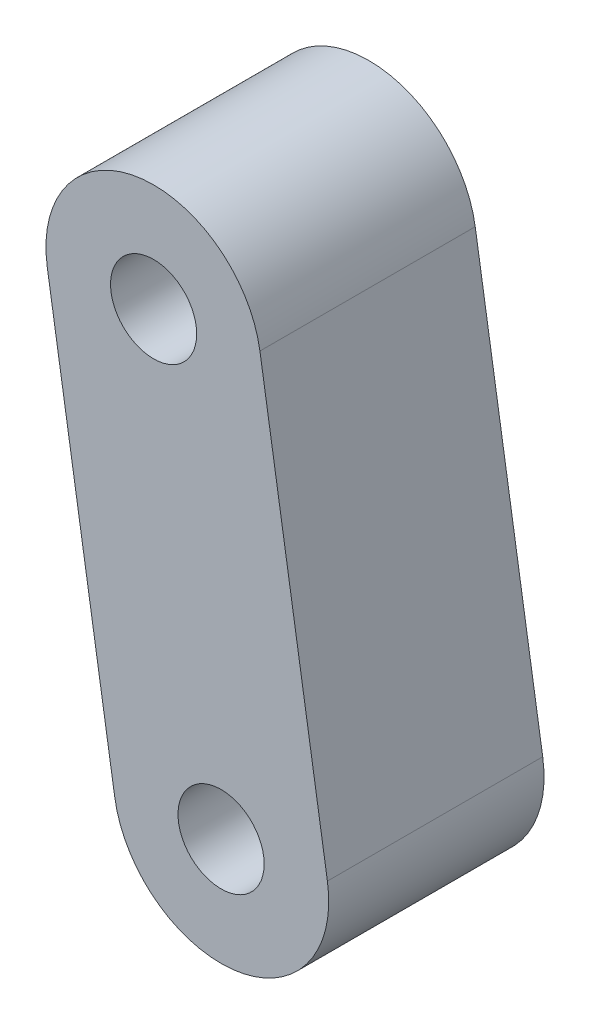
ISO-10303-21;
HEADER;
FILE_DESCRIPTION(('STEP AP214'),'2;1');
FILE_NAME('part.step','',(''),(''),'','','');
FILE_SCHEMA(('AUTOMOTIVE_DESIGN { 1 0 10303 214 1 1 1 1 }'));
ENDSEC;
DATA;
#1=APPLICATION_CONTEXT('core data for automotive mechanical design processes');
#2=APPLICATION_PROTOCOL_DEFINITION('international standard','automotive_design',2000,#1);
#3=PRODUCT_CONTEXT('',#1,'mechanical');
#4=PRODUCT('Part','Part','',(#3));
#5=PRODUCT_RELATED_PRODUCT_CATEGORY('part','',(#4));
#6=PRODUCT_DEFINITION_FORMATION('','',#4);
#7=PRODUCT_DEFINITION_CONTEXT('part definition',#1,'design');
#8=PRODUCT_DEFINITION('design','',#6,#7);
#9=PRODUCT_DEFINITION_SHAPE('','',#8);
#10=(LENGTH_UNIT() NAMED_UNIT(*) SI_UNIT(.MILLI.,.METRE.));
#11=(NAMED_UNIT(*) PLANE_ANGLE_UNIT() SI_UNIT($,.RADIAN.));
#12=(NAMED_UNIT(*) SI_UNIT($,.STERADIAN.) SOLID_ANGLE_UNIT());
#13=UNCERTAINTY_MEASURE_WITH_UNIT(LENGTH_MEASURE(1.E-05),#10,'distance_accuracy_value','');
#14=(GEOMETRIC_REPRESENTATION_CONTEXT(3) GLOBAL_UNCERTAINTY_ASSIGNED_CONTEXT((#13)) GLOBAL_UNIT_ASSIGNED_CONTEXT((#10,
#11,#12)) REPRESENTATION_CONTEXT('',''));
#15=CARTESIAN_POINT('',(0.,0.,0.));
#16=DIRECTION('',(0.,0.,1.));
#17=DIRECTION('',(1.,0.,0.));
#18=AXIS2_PLACEMENT_3D('',#15,#16,#17);
#19=CARTESIAN_POINT('',(-59.1343390927748,15.7528711445072,10.));
#20=DIRECTION('',(0.,0.,1.));
#21=DIRECTION('',(1.,0.,0.));
#22=AXIS2_PLACEMENT_3D('',#19,#20,#21);
#23=PLANE('',#22);
#24=CARTESIAN_POINT('',(-59.1343390927748,15.7528711445072,10.));
#25=DIRECTION('',(0.,0.,1.));
#26=DIRECTION('',(1.,0.,0.));
#27=AXIS2_PLACEMENT_3D('',#24,#25,#26);
#28=CIRCLE('',#27,2.);
#29=CARTESIAN_POINT('',(-57.1343390927748,15.7528711445072,10.));
#30=VERTEX_POINT('',#29);
#31=EDGE_CURVE('E103',#30,#30,#28,.T.);
#32=ORIENTED_EDGE('',*,*,#31,.F.);
#33=EDGE_LOOP('',(#32));
#34=FACE_BOUND('',#33,.T.);
#35=CARTESIAN_POINT('',(-59.1343390927748,15.7528711445072,10.));
#36=DIRECTION('',(0.,0.,1.));
#37=DIRECTION('',(1.,0.,0.));
#38=AXIS2_PLACEMENT_3D('',#35,#36,#37);
#39=CIRCLE('',#38,5.);
#40=CARTESIAN_POINT('',(-54.196121306648,16.5364559177009,10.));
#41=VERTEX_POINT('',#40);
#42=CARTESIAN_POINT('',(-64.0725568789016,14.9692863713135,10.));
#43=VERTEX_POINT('',#42);
#44=EDGE_CURVE('E88',#41,#43,#39,.T.);
#45=ORIENTED_EDGE('',*,*,#44,.T.);
#46=DIRECTION('',(0.156716954638739,-0.987643557225358,0.));
#47=VECTOR('',#46,1.);
#48=CARTESIAN_POINT('',(-64.0725568789016,14.9692863713135,10.));
#49=LINE('',#48,#47);
#50=CARTESIAN_POINT('',(-60.9382177861268,-4.78358477319369,10.));
#51=VERTEX_POINT('',#50);
#52=EDGE_CURVE('E83',#43,#51,#49,.T.);
#53=ORIENTED_EDGE('',*,*,#52,.T.);
#54=CARTESIAN_POINT('',(-56.,-4.,10.));
#55=DIRECTION('',(0.,0.,1.));
#56=DIRECTION('',(1.,0.,0.));
#57=AXIS2_PLACEMENT_3D('',#54,#55,#56);
#58=CIRCLE('',#57,5.);
#59=CARTESIAN_POINT('',(-51.0617822138732,-3.21641522680631,10.));
#60=VERTEX_POINT('',#59);
#61=EDGE_CURVE('E86',#51,#60,#58,.T.);
#62=ORIENTED_EDGE('',*,*,#61,.T.);
#63=DIRECTION('',(-0.156716954638739,0.987643557225358,0.));
#64=VECTOR('',#63,1.);
#65=CARTESIAN_POINT('',(-54.196121306648,16.5364559177009,10.));
#66=LINE('',#65,#64);
#67=EDGE_CURVE('E53',#60,#41,#66,.T.);
#68=ORIENTED_EDGE('',*,*,#67,.T.);
#69=EDGE_LOOP('',(#45,#53,#62,#68));
#70=FACE_BOUND('',#69,.T.);
#71=CARTESIAN_POINT('',(-56.,-4.,10.));
#72=DIRECTION('',(0.,0.,1.));
#73=DIRECTION('',(1.,0.,0.));
#74=AXIS2_PLACEMENT_3D('',#71,#72,#73);
#75=CIRCLE('',#74,2.);
#76=CARTESIAN_POINT('',(-54.,-4.,10.));
#77=VERTEX_POINT('',#76);
#78=EDGE_CURVE('E118',#77,#77,#75,.T.);
#79=ORIENTED_EDGE('',*,*,#78,.F.);
#80=EDGE_LOOP('',(#79));
#81=FACE_BOUND('',#80,.T.);
#82=ADVANCED_FACE('F36',(#34,#70,#81),#23,.T.);
#83=CARTESIAN_POINT('',(-59.1343390927748,15.7528711445072,0.));
#84=DIRECTION('',(0.,0.,1.));
#85=DIRECTION('',(1.,0.,0.));
#86=AXIS2_PLACEMENT_3D('',#83,#84,#85);
#87=PLANE('',#86);
#88=CARTESIAN_POINT('',(-59.1343390927748,15.7528711445072,0.));
#89=DIRECTION('',(0.,0.,1.));
#90=DIRECTION('',(1.,0.,0.));
#91=AXIS2_PLACEMENT_3D('',#88,#89,#90);
#92=CIRCLE('',#91,5.);
#93=CARTESIAN_POINT('',(-54.196121306648,16.5364559177009,0.));
#94=VERTEX_POINT('',#93);
#95=CARTESIAN_POINT('',(-64.0725568789016,14.9692863713135,0.));
#96=VERTEX_POINT('',#95);
#97=EDGE_CURVE('E100',#94,#96,#92,.T.);
#98=ORIENTED_EDGE('',*,*,#97,.F.);
#99=DIRECTION('',(-0.156716954638739,0.987643557225358,0.));
#100=VECTOR('',#99,1.);
#101=CARTESIAN_POINT('',(-54.196121306648,16.5364559177009,0.));
#102=LINE('',#101,#100);
#103=CARTESIAN_POINT('',(-51.0617822138732,-3.21641522680631,0.));
#104=VERTEX_POINT('',#103);
#105=EDGE_CURVE('E76',#104,#94,#102,.T.);
#106=ORIENTED_EDGE('',*,*,#105,.F.);
#107=CARTESIAN_POINT('',(-56.,-4.,0.));
#108=DIRECTION('',(0.,0.,1.));
#109=DIRECTION('',(1.,0.,0.));
#110=AXIS2_PLACEMENT_3D('',#107,#108,#109);
#111=CIRCLE('',#110,5.);
#112=CARTESIAN_POINT('',(-60.9382177861268,-4.78358477319369,0.));
#113=VERTEX_POINT('',#112);
#114=EDGE_CURVE('E70',#113,#104,#111,.T.);
#115=ORIENTED_EDGE('',*,*,#114,.F.);
#116=DIRECTION('',(0.156716954638739,-0.987643557225358,0.));
#117=VECTOR('',#116,1.);
#118=CARTESIAN_POINT('',(-64.0725568789016,14.9692863713135,0.));
#119=LINE('',#118,#117);
#120=EDGE_CURVE('E92',#96,#113,#119,.T.);
#121=ORIENTED_EDGE('',*,*,#120,.F.);
#122=EDGE_LOOP('',(#98,#106,#115,#121));
#123=FACE_BOUND('',#122,.T.);
#124=CARTESIAN_POINT('',(-59.1343390927748,15.7528711445072,0.));
#125=DIRECTION('',(0.,0.,1.));
#126=DIRECTION('',(1.,0.,0.));
#127=AXIS2_PLACEMENT_3D('',#124,#125,#126);
#128=CIRCLE('',#127,2.);
#129=CARTESIAN_POINT('',(-57.1343390927748,15.7528711445072,0.));
#130=VERTEX_POINT('',#129);
#131=EDGE_CURVE('E115',#130,#130,#128,.T.);
#132=ORIENTED_EDGE('',*,*,#131,.T.);
#133=EDGE_LOOP('',(#132));
#134=FACE_BOUND('',#133,.T.);
#135=CARTESIAN_POINT('',(-56.,-4.,0.));
#136=DIRECTION('',(0.,0.,1.));
#137=DIRECTION('',(1.,0.,0.));
#138=AXIS2_PLACEMENT_3D('',#135,#136,#137);
#139=CIRCLE('',#138,2.);
#140=CARTESIAN_POINT('',(-54.,-4.,0.));
#141=VERTEX_POINT('',#140);
#142=EDGE_CURVE('E121',#141,#141,#139,.T.);
#143=ORIENTED_EDGE('',*,*,#142,.T.);
#144=EDGE_LOOP('',(#143));
#145=FACE_BOUND('',#144,.T.);
#146=ADVANCED_FACE('F111',(#123,#134,#145),#87,.F.);
#147=CARTESIAN_POINT('',(-59.1343390927748,15.7528711445072,10.));
#148=DIRECTION('',(0.,0.,-1.));
#149=DIRECTION('',(-1.,0.,0.));
#150=AXIS2_PLACEMENT_3D('',#147,#148,#149);
#151=CYLINDRICAL_SURFACE('',#150,5.);
#152=ORIENTED_EDGE('',*,*,#97,.T.);
#153=DIRECTION('',(0.,0.,-1.));
#154=VECTOR('',#153,1.);
#155=CARTESIAN_POINT('',(-64.0725568789016,14.9692863713135,10.));
#156=LINE('',#155,#154);
#157=EDGE_CURVE('E11',#43,#96,#156,.T.);
#158=ORIENTED_EDGE('',*,*,#157,.F.);
#159=ORIENTED_EDGE('',*,*,#44,.F.);
#160=DIRECTION('',(0.,0.,-1.));
#161=VECTOR('',#160,1.);
#162=CARTESIAN_POINT('',(-54.196121306648,16.5364559177009,10.));
#163=LINE('',#162,#161);
#164=EDGE_CURVE('E96',#41,#94,#163,.T.);
#165=ORIENTED_EDGE('',*,*,#164,.T.);
#166=EDGE_LOOP('',(#152,#158,#159,#165));
#167=FACE_BOUND('',#166,.T.);
#168=ADVANCED_FACE('F38',(#167),#151,.T.);
#169=CARTESIAN_POINT('',(-64.0725568789016,14.9692863713135,10.));
#170=DIRECTION('',(0.987643557225358,0.156716954638739,0.));
#171=DIRECTION('',(-0.156716954638739,0.987643557225358,0.));
#172=AXIS2_PLACEMENT_3D('',#169,#170,#171);
#173=PLANE('',#172);
#174=ORIENTED_EDGE('',*,*,#120,.T.);
#175=DIRECTION('',(0.,0.,-1.));
#176=VECTOR('',#175,1.);
#177=CARTESIAN_POINT('',(-60.9382177861268,-4.78358477319369,10.));
#178=LINE('',#177,#176);
#179=EDGE_CURVE('E45',#51,#113,#178,.T.);
#180=ORIENTED_EDGE('',*,*,#179,.F.);
#181=ORIENTED_EDGE('',*,*,#52,.F.);
#182=ORIENTED_EDGE('',*,*,#157,.T.);
#183=EDGE_LOOP('',(#174,#180,#181,#182));
#184=FACE_BOUND('',#183,.T.);
#185=ADVANCED_FACE('F91',(#184),#173,.F.);
#186=CARTESIAN_POINT('',(-56.,-4.,10.));
#187=DIRECTION('',(0.,0.,-1.));
#188=DIRECTION('',(-1.,0.,0.));
#189=AXIS2_PLACEMENT_3D('',#186,#187,#188);
#190=CYLINDRICAL_SURFACE('',#189,5.);
#191=ORIENTED_EDGE('',*,*,#114,.T.);
#192=DIRECTION('',(0.,0.,-1.));
#193=VECTOR('',#192,1.);
#194=CARTESIAN_POINT('',(-51.0617822138732,-3.21641522680631,10.));
#195=LINE('',#194,#193);
#196=EDGE_CURVE('E93',#60,#104,#195,.T.);
#197=ORIENTED_EDGE('',*,*,#196,.F.);
#198=ORIENTED_EDGE('',*,*,#61,.F.);
#199=ORIENTED_EDGE('',*,*,#179,.T.);
#200=EDGE_LOOP('',(#191,#197,#198,#199));
#201=FACE_BOUND('',#200,.T.);
#202=ADVANCED_FACE('F94',(#201),#190,.T.);
#203=CARTESIAN_POINT('',(-54.196121306648,16.5364559177009,10.));
#204=DIRECTION('',(-0.987643557225358,-0.156716954638739,0.));
#205=DIRECTION('',(0.156716954638739,-0.987643557225358,0.));
#206=AXIS2_PLACEMENT_3D('',#203,#204,#205);
#207=PLANE('',#206);
#208=ORIENTED_EDGE('',*,*,#105,.T.);
#209=ORIENTED_EDGE('',*,*,#164,.F.);
#210=ORIENTED_EDGE('',*,*,#67,.F.);
#211=ORIENTED_EDGE('',*,*,#196,.T.);
#212=EDGE_LOOP('',(#208,#209,#210,#211));
#213=FACE_BOUND('',#212,.T.);
#214=ADVANCED_FACE('F108',(#213),#207,.F.);
#215=CARTESIAN_POINT('',(-59.1343390927748,15.7528711445072,10.));
#216=DIRECTION('',(0.,0.,-1.));
#217=DIRECTION('',(-1.,0.,0.));
#218=AXIS2_PLACEMENT_3D('',#215,#216,#217);
#219=CYLINDRICAL_SURFACE('',#218,2.);
#220=ORIENTED_EDGE('',*,*,#31,.T.);
#221=EDGE_LOOP('',(#220));
#222=FACE_BOUND('',#221,.T.);
#223=ORIENTED_EDGE('',*,*,#131,.F.);
#224=EDGE_LOOP('',(#223));
#225=FACE_BOUND('',#224,.T.);
#226=ADVANCED_FACE('F138',(#222,#225),#219,.F.);
#227=CARTESIAN_POINT('',(-56.,-4.,10.));
#228=DIRECTION('',(0.,0.,-1.));
#229=DIRECTION('',(-1.,0.,0.));
#230=AXIS2_PLACEMENT_3D('',#227,#228,#229);
#231=CYLINDRICAL_SURFACE('',#230,2.);
#232=ORIENTED_EDGE('',*,*,#78,.T.);
#233=EDGE_LOOP('',(#232));
#234=FACE_BOUND('',#233,.T.);
#235=ORIENTED_EDGE('',*,*,#142,.F.);
#236=EDGE_LOOP('',(#235));
#237=FACE_BOUND('',#236,.T.);
#238=ADVANCED_FACE('F127',(#234,#237),#231,.F.);
#239=CLOSED_SHELL('',(#82,#146,#168,#185,#202,#214,#226,#238));
#240=MANIFOLD_SOLID_BREP('B2',#239);
#241=ADVANCED_BREP_SHAPE_REPRESENTATION('',(#18,#240),#14);
#242=SHAPE_DEFINITION_REPRESENTATION(#9,#241);
ENDSEC;
END-ISO-10303-21;
